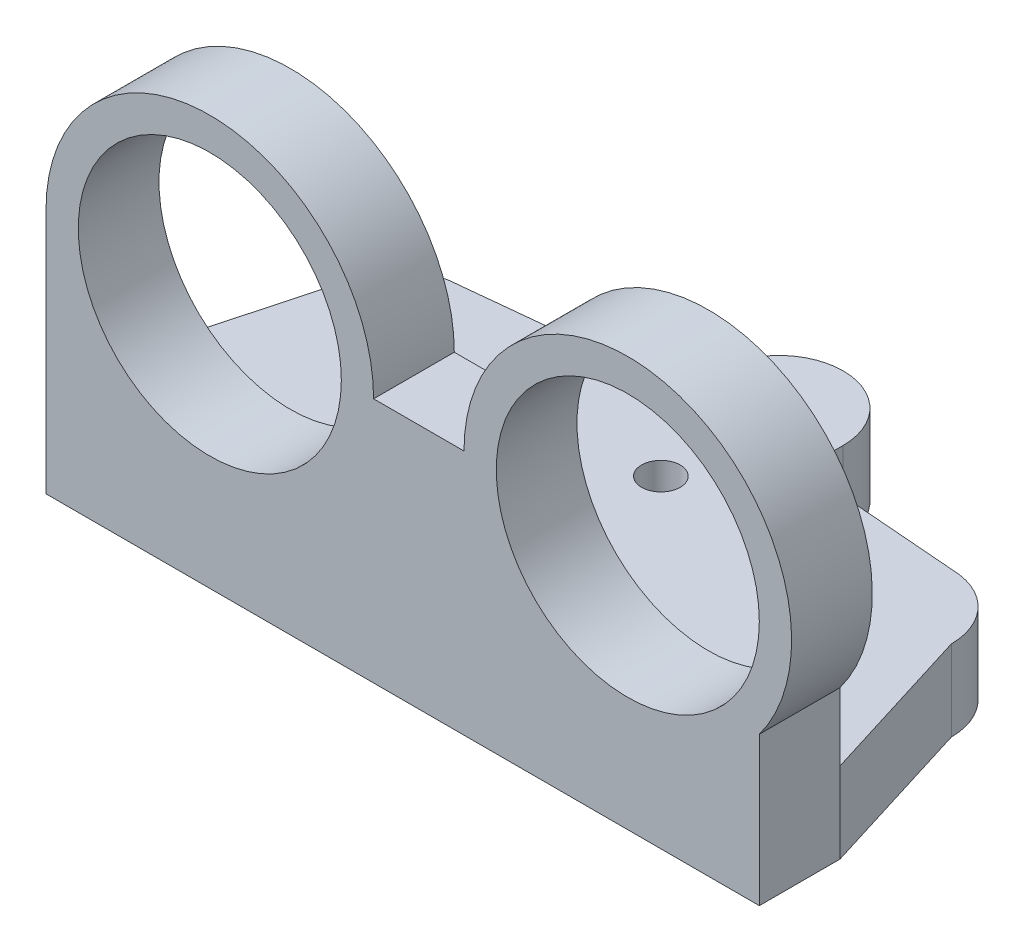
ISO-10303-21;
HEADER;
FILE_DESCRIPTION(('STEP AP214'),'2;1');
FILE_NAME('part.step','',(''),(''),'','','');
FILE_SCHEMA(('AUTOMOTIVE_DESIGN { 1 0 10303 214 1 1 1 1 }'));
ENDSEC;
DATA;
#1=APPLICATION_CONTEXT('core data for automotive mechanical design processes');
#2=APPLICATION_PROTOCOL_DEFINITION('international standard','automotive_design',2000,#1);
#3=PRODUCT_CONTEXT('',#1,'mechanical');
#4=PRODUCT('Part','Part','',(#3));
#5=PRODUCT_RELATED_PRODUCT_CATEGORY('part','',(#4));
#6=PRODUCT_DEFINITION_FORMATION('','',#4);
#7=PRODUCT_DEFINITION_CONTEXT('part definition',#1,'design');
#8=PRODUCT_DEFINITION('design','',#6,#7);
#9=PRODUCT_DEFINITION_SHAPE('','',#8);
#10=(LENGTH_UNIT() NAMED_UNIT(*) SI_UNIT(.MILLI.,.METRE.));
#11=(NAMED_UNIT(*) PLANE_ANGLE_UNIT() SI_UNIT($,.RADIAN.));
#12=(NAMED_UNIT(*) SI_UNIT($,.STERADIAN.) SOLID_ANGLE_UNIT());
#13=UNCERTAINTY_MEASURE_WITH_UNIT(LENGTH_MEASURE(1.E-05),#10,'distance_accuracy_value','');
#14=(GEOMETRIC_REPRESENTATION_CONTEXT(3) GLOBAL_UNCERTAINTY_ASSIGNED_CONTEXT((#13)) GLOBAL_UNIT_ASSIGNED_CONTEXT((#10,
#11,#12)) REPRESENTATION_CONTEXT('',''));
#15=CARTESIAN_POINT('',(0.,0.,0.));
#16=DIRECTION('',(0.,0.,1.));
#17=DIRECTION('',(1.,0.,0.));
#18=AXIS2_PLACEMENT_3D('',#15,#16,#17);
#19=CARTESIAN_POINT('',(-16.4,5.,0.));
#20=DIRECTION('',(0.,1.,0.));
#21=DIRECTION('',(0.,0.,1.));
#22=AXIS2_PLACEMENT_3D('',#19,#20,#21);
#23=PLANE('',#22);
#24=CARTESIAN_POINT('',(0.,5.,0.));
#25=DIRECTION('',(0.,1.,0.));
#26=DIRECTION('',(0.,0.,1.));
#27=AXIS2_PLACEMENT_3D('',#24,#25,#26);
#28=CIRCLE('',#27,1.2);
#29=CARTESIAN_POINT('',(0.,5.,1.2));
#30=VERTEX_POINT('',#29);
#31=EDGE_CURVE('E297',#30,#30,#28,.T.);
#32=ORIENTED_EDGE('',*,*,#31,.F.);
#33=EDGE_LOOP('',(#32));
#34=FACE_BOUND('',#33,.T.);
#35=CARTESIAN_POINT('',(-16.4,5.,0.));
#36=DIRECTION('',(0.,1.,0.));
#37=DIRECTION('',(0.,0.,1.));
#38=AXIS2_PLACEMENT_3D('',#35,#36,#37);
#39=CIRCLE('',#38,4.);
#40=CARTESIAN_POINT('',(-16.5216474494042,5.,-3.998149809356));
#41=VERTEX_POINT('',#40);
#42=CARTESIAN_POINT('',(-20.4,5.,0.));
#43=VERTEX_POINT('',#42);
#44=EDGE_CURVE('E308',#41,#43,#39,.T.);
#45=ORIENTED_EDGE('',*,*,#44,.T.);
#46=DIRECTION('',(-0.260665852290765,0.,0.965429082558387));
#47=VECTOR('',#46,1.);
#48=CARTESIAN_POINT('',(-19.0138875943704,5.,-5.13374965048001));
#49=LINE('',#48,#47);
#50=CARTESIAN_POINT('',(-23.1,5.,10.));
#51=VERTEX_POINT('',#50);
#52=EDGE_CURVE('E472',#43,#51,#49,.T.);
#53=ORIENTED_EDGE('',*,*,#52,.T.);
#54=DIRECTION('',(1.,0.,0.));
#55=VECTOR('',#54,1.);
#56=CARTESIAN_POINT('',(0.,5.,10.));
#57=LINE('',#56,#55);
#58=CARTESIAN_POINT('',(21.1,5.,10.));
#59=VERTEX_POINT('',#58);
#60=EDGE_CURVE('E11',#51,#59,#57,.T.);
#61=ORIENTED_EDGE('',*,*,#60,.T.);
#62=DIRECTION('',(-0.29609877111408,0.,-0.955157326174454));
#63=VECTOR('',#62,1.);
#64=CARTESIAN_POINT('',(16.4218593194052,5.,-5.09077638901559));
#65=LINE('',#64,#63);
#66=CARTESIAN_POINT('',(18.,5.,0.));
#67=VERTEX_POINT('',#66);
#68=EDGE_CURVE('E475',#59,#67,#65,.T.);
#69=ORIENTED_EDGE('',*,*,#68,.T.);
#70=CARTESIAN_POINT('',(14.,5.,0.));
#71=DIRECTION('',(0.,1.,0.));
#72=DIRECTION('',(0.,0.,1.));
#73=AXIS2_PLACEMENT_3D('',#70,#71,#72);
#74=CIRCLE('',#73,4.);
#75=CARTESIAN_POINT('',(14.0925772754253,5.,-3.99892853750537));
#76=VERTEX_POINT('',#75);
#77=EDGE_CURVE('E62',#67,#76,#74,.T.);
#78=ORIENTED_EDGE('',*,*,#77,.T.);
#79=DIRECTION('',(-0.996880972863207,0.,-0.0789197436850038));
#80=VECTOR('',#79,1.);
#81=CARTESIAN_POINT('',(14.0925772754253,5.,-3.99892853750537));
#82=LINE('',#81,#80);
#83=CARTESIAN_POINT('',(4.,5.,-4.79792423847654));
#84=VERTEX_POINT('',#83);
#85=EDGE_CURVE('E311',#76,#84,#82,.T.);
#86=ORIENTED_EDGE('',*,*,#85,.T.);
#87=DIRECTION('',(0.,0.,-1.));
#88=VECTOR('',#87,1.);
#89=CARTESIAN_POINT('',(4.,5.,-4.79792423847654));
#90=LINE('',#89,#88);
#91=CARTESIAN_POINT('',(4.,5.,-7.3));
#92=VERTEX_POINT('',#91);
#93=EDGE_CURVE('E314',#84,#92,#90,.T.);
#94=ORIENTED_EDGE('',*,*,#93,.T.);
#95=CARTESIAN_POINT('',(0.,5.,-7.3));
#96=DIRECTION('',(0.,1.,0.));
#97=DIRECTION('',(0.,0.,1.));
#98=AXIS2_PLACEMENT_3D('',#95,#96,#97);
#99=CIRCLE('',#98,4.);
#100=CARTESIAN_POINT('',(-4.,5.,-7.3));
#101=VERTEX_POINT('',#100);
#102=EDGE_CURVE('E317',#92,#101,#99,.T.);
#103=ORIENTED_EDGE('',*,*,#102,.T.);
#104=DIRECTION('',(0.,0.,1.));
#105=VECTOR('',#104,1.);
#106=CARTESIAN_POINT('',(-4.,5.,-7.3));
#107=LINE('',#106,#105);
#108=CARTESIAN_POINT('',(-4.,5.,-5.30248808533561));
#109=VERTEX_POINT('',#108);
#110=EDGE_CURVE('E300',#101,#109,#107,.T.);
#111=ORIENTED_EDGE('',*,*,#110,.T.);
#112=DIRECTION('',(-0.994618408890778,0.,0.103606084259456));
#113=VECTOR('',#112,1.);
#114=CARTESIAN_POINT('',(-4.,5.,-5.30248808533561));
#115=LINE('',#114,#113);
#116=EDGE_CURVE('E305',#109,#41,#115,.T.);
#117=ORIENTED_EDGE('',*,*,#116,.T.);
#118=EDGE_LOOP('',(#45,#53,#61,#69,#78,#86,#94,#103,#111,#117));
#119=FACE_BOUND('',#118,.T.);
#120=ADVANCED_FACE('F37',(#34,#119),#23,.T.);
#121=CARTESIAN_POINT('',(-16.4,3.,0.));
#122=DIRECTION('',(0.,-1.,0.));
#123=DIRECTION('',(0.,0.,-1.));
#124=AXIS2_PLACEMENT_3D('',#121,#122,#123);
#125=CYLINDRICAL_SURFACE('',#124,2.);
#126=CARTESIAN_POINT('',(-16.4,0.,0.));
#127=DIRECTION('',(0.,1.,0.));
#128=DIRECTION('',(0.,0.,1.));
#129=AXIS2_PLACEMENT_3D('',#126,#127,#128);
#130=CIRCLE('',#129,2.);
#131=CARTESIAN_POINT('',(-16.4,0.,-2.));
#132=VERTEX_POINT('',#131);
#133=CARTESIAN_POINT('',(-16.4,0.,2.));
#134=VERTEX_POINT('',#133);
#135=EDGE_CURVE('E372',#132,#134,#130,.T.);
#136=ORIENTED_EDGE('',*,*,#135,.F.);
#137=DIRECTION('',(0.,-1.,0.));
#138=VECTOR('',#137,1.);
#139=CARTESIAN_POINT('',(-16.4,3.,-2.));
#140=LINE('',#139,#138);
#141=CARTESIAN_POINT('',(-16.4,3.,-2.));
#142=VERTEX_POINT('',#141);
#143=EDGE_CURVE('E46',#142,#132,#140,.T.);
#144=ORIENTED_EDGE('',*,*,#143,.F.);
#145=CARTESIAN_POINT('',(-16.4,3.,0.));
#146=DIRECTION('',(0.,1.,0.));
#147=DIRECTION('',(0.,0.,1.));
#148=AXIS2_PLACEMENT_3D('',#145,#146,#147);
#149=CIRCLE('',#148,2.);
#150=CARTESIAN_POINT('',(-16.4,3.,2.));
#151=VERTEX_POINT('',#150);
#152=EDGE_CURVE('E321',#142,#151,#149,.T.);
#153=ORIENTED_EDGE('',*,*,#152,.T.);
#154=DIRECTION('',(0.,-1.,0.));
#155=VECTOR('',#154,1.);
#156=CARTESIAN_POINT('',(-16.4,3.,2.));
#157=LINE('',#156,#155);
#158=EDGE_CURVE('E407',#151,#134,#157,.T.);
#159=ORIENTED_EDGE('',*,*,#158,.T.);
#160=EDGE_LOOP('',(#136,#144,#153,#159));
#161=FACE_BOUND('',#160,.T.);
#162=ADVANCED_FACE('F496',(#161),#125,.F.);
#163=CARTESIAN_POINT('',(-0.382138256762559,3.,-3.66852726492057));
#164=DIRECTION('',(-0.103606084259456,0.,-0.994618408890778));
#165=DIRECTION('',(-0.994618408890778,0.,0.103606084259456));
#166=AXIS2_PLACEMENT_3D('',#163,#164,#165);
#167=PLANE('',#166);
#168=DIRECTION('',(0.994618408890778,0.,-0.103606084259456));
#169=VECTOR('',#168,1.);
#170=CARTESIAN_POINT('',(-0.382138256762559,0.,-3.66852726492057));
#171=LINE('',#170,#169);
#172=CARTESIAN_POINT('',(-1.99999999999999,0.,-3.5));
#173=VERTEX_POINT('',#172);
#174=EDGE_CURVE('E375',#132,#173,#171,.T.);
#175=ORIENTED_EDGE('',*,*,#174,.T.);
#176=DIRECTION('',(0.,-1.,0.));
#177=VECTOR('',#176,1.);
#178=CARTESIAN_POINT('',(-1.99999999999999,3.,-3.5));
#179=LINE('',#178,#177);
#180=CARTESIAN_POINT('',(-2.,3.,-3.5));
#181=VERTEX_POINT('',#180);
#182=EDGE_CURVE('E428',#181,#173,#179,.T.);
#183=ORIENTED_EDGE('',*,*,#182,.F.);
#184=DIRECTION('',(0.994618408890778,0.,-0.103606084259456));
#185=VECTOR('',#184,1.);
#186=CARTESIAN_POINT('',(-0.382138256762559,3.,-3.66852726492057));
#187=LINE('',#186,#185);
#188=EDGE_CURVE('E324',#142,#181,#187,.T.);
#189=ORIENTED_EDGE('',*,*,#188,.F.);
#190=ORIENTED_EDGE('',*,*,#143,.T.);
#191=EDGE_LOOP('',(#175,#183,#189,#190));
#192=FACE_BOUND('',#191,.T.);
#193=ADVANCED_FACE('F502',(#192),#167,.F.);
#194=CARTESIAN_POINT('',(-2.,3.,0.));
#195=DIRECTION('',(1.,0.,0.));
#196=DIRECTION('',(0.,0.,-1.));
#197=AXIS2_PLACEMENT_3D('',#194,#195,#196);
#198=PLANE('',#197);
#199=DIRECTION('',(0.,0.,1.));
#200=VECTOR('',#199,1.);
#201=CARTESIAN_POINT('',(-2.,0.,0.));
#202=LINE('',#201,#200);
#203=CARTESIAN_POINT('',(-2.,0.,-7.3));
#204=VERTEX_POINT('',#203);
#205=EDGE_CURVE('E378',#204,#173,#202,.T.);
#206=ORIENTED_EDGE('',*,*,#205,.F.);
#207=DIRECTION('',(0.,-1.,0.));
#208=VECTOR('',#207,1.);
#209=CARTESIAN_POINT('',(-2.,3.,-7.3));
#210=LINE('',#209,#208);
#211=CARTESIAN_POINT('',(-2.,3.,-7.3));
#212=VERTEX_POINT('',#211);
#213=EDGE_CURVE('E426',#212,#204,#210,.T.);
#214=ORIENTED_EDGE('',*,*,#213,.F.);
#215=DIRECTION('',(0.,0.,1.));
#216=VECTOR('',#215,1.);
#217=CARTESIAN_POINT('',(-2.,3.,0.));
#218=LINE('',#217,#216);
#219=EDGE_CURVE('E327',#212,#181,#218,.T.);
#220=ORIENTED_EDGE('',*,*,#219,.T.);
#221=ORIENTED_EDGE('',*,*,#182,.T.);
#222=EDGE_LOOP('',(#206,#214,#220,#221));
#223=FACE_BOUND('',#222,.T.);
#224=ADVANCED_FACE('F550',(#223),#198,.T.);
#225=CARTESIAN_POINT('',(0.,3.,-7.3));
#226=DIRECTION('',(0.,-1.,0.));
#227=DIRECTION('',(0.,0.,-1.));
#228=AXIS2_PLACEMENT_3D('',#225,#226,#227);
#229=CYLINDRICAL_SURFACE('',#228,2.);
#230=CARTESIAN_POINT('',(0.,0.,-7.3));
#231=DIRECTION('',(0.,1.,0.));
#232=DIRECTION('',(0.,0.,1.));
#233=AXIS2_PLACEMENT_3D('',#230,#231,#232);
#234=CIRCLE('',#233,2.);
#235=CARTESIAN_POINT('',(2.,0.,-7.3));
#236=VERTEX_POINT('',#235);
#237=EDGE_CURVE('E381',#236,#204,#234,.T.);
#238=ORIENTED_EDGE('',*,*,#237,.F.);
#239=DIRECTION('',(0.,-1.,0.));
#240=VECTOR('',#239,1.);
#241=CARTESIAN_POINT('',(2.,3.,-7.3));
#242=LINE('',#241,#240);
#243=CARTESIAN_POINT('',(2.,3.,-7.3));
#244=VERTEX_POINT('',#243);
#245=EDGE_CURVE('E424',#244,#236,#242,.T.);
#246=ORIENTED_EDGE('',*,*,#245,.F.);
#247=CARTESIAN_POINT('',(0.,3.,-7.3));
#248=DIRECTION('',(0.,1.,0.));
#249=DIRECTION('',(0.,0.,1.));
#250=AXIS2_PLACEMENT_3D('',#247,#248,#249);
#251=CIRCLE('',#250,2.);
#252=EDGE_CURVE('E330',#244,#212,#251,.T.);
#253=ORIENTED_EDGE('',*,*,#252,.T.);
#254=ORIENTED_EDGE('',*,*,#213,.T.);
#255=EDGE_LOOP('',(#238,#246,#253,#254));
#256=FACE_BOUND('',#255,.T.);
#257=ADVANCED_FACE('F546',(#256),#229,.F.);
#258=CARTESIAN_POINT('',(2.,3.,0.));
#259=DIRECTION('',(1.,0.,0.));
#260=DIRECTION('',(0.,0.,-1.));
#261=AXIS2_PLACEMENT_3D('',#258,#259,#260);
#262=PLANE('',#261);
#263=DIRECTION('',(0.,0.,1.));
#264=VECTOR('',#263,1.);
#265=CARTESIAN_POINT('',(2.,0.,0.));
#266=LINE('',#265,#264);
#267=CARTESIAN_POINT('',(2.,0.,-2.95));
#268=VERTEX_POINT('',#267);
#269=EDGE_CURVE('E384',#236,#268,#266,.T.);
#270=ORIENTED_EDGE('',*,*,#269,.T.);
#271=DIRECTION('',(0.,-1.,0.));
#272=VECTOR('',#271,1.);
#273=CARTESIAN_POINT('',(2.,3.,-2.95));
#274=LINE('',#273,#272);
#275=CARTESIAN_POINT('',(2.,3.,-2.95));
#276=VERTEX_POINT('',#275);
#277=EDGE_CURVE('E422',#276,#268,#274,.T.);
#278=ORIENTED_EDGE('',*,*,#277,.F.);
#279=DIRECTION('',(0.,0.,1.));
#280=VECTOR('',#279,1.);
#281=CARTESIAN_POINT('',(2.,3.,0.));
#282=LINE('',#281,#280);
#283=EDGE_CURVE('E333',#244,#276,#282,.T.);
#284=ORIENTED_EDGE('',*,*,#283,.F.);
#285=ORIENTED_EDGE('',*,*,#245,.T.);
#286=EDGE_LOOP('',(#270,#278,#284,#285));
#287=FACE_BOUND('',#286,.T.);
#288=ADVANCED_FACE('F542',(#287),#262,.F.);
#289=CARTESIAN_POINT('',(0.244543744931938,3.,-3.08897362019289));
#290=DIRECTION('',(-0.0789197436850041,0.,0.996880972863207));
#291=DIRECTION('',(0.996880972863207,0.,0.0789197436850041));
#292=AXIS2_PLACEMENT_3D('',#289,#290,#291);
#293=PLANE('',#292);
#294=DIRECTION('',(-0.996880972863207,0.,-0.0789197436850041));
#295=VECTOR('',#294,1.);
#296=CARTESIAN_POINT('',(0.244543744931938,0.,-3.08897362019289));
#297=LINE('',#296,#295);
#298=CARTESIAN_POINT('',(14.,0.,-2.));
#299=VERTEX_POINT('',#298);
#300=EDGE_CURVE('E387',#299,#268,#297,.T.);
#301=ORIENTED_EDGE('',*,*,#300,.F.);
#302=DIRECTION('',(0.,-1.,0.));
#303=VECTOR('',#302,1.);
#304=CARTESIAN_POINT('',(14.,3.,-2.));
#305=LINE('',#304,#303);
#306=CARTESIAN_POINT('',(14.,3.,-2.));
#307=VERTEX_POINT('',#306);
#308=EDGE_CURVE('E420',#307,#299,#305,.T.);
#309=ORIENTED_EDGE('',*,*,#308,.F.);
#310=DIRECTION('',(-0.996880972863207,0.,-0.0789197436850041));
#311=VECTOR('',#310,1.);
#312=CARTESIAN_POINT('',(0.244543744931938,3.,-3.08897362019289));
#313=LINE('',#312,#311);
#314=EDGE_CURVE('E335',#307,#276,#313,.T.);
#315=ORIENTED_EDGE('',*,*,#314,.T.);
#316=ORIENTED_EDGE('',*,*,#277,.T.);
#317=EDGE_LOOP('',(#301,#309,#315,#316));
#318=FACE_BOUND('',#317,.T.);
#319=ADVANCED_FACE('F538',(#318),#293,.T.);
#320=CARTESIAN_POINT('',(14.,3.,0.));
#321=DIRECTION('',(0.,-1.,0.));
#322=DIRECTION('',(0.,0.,-1.));
#323=AXIS2_PLACEMENT_3D('',#320,#321,#322);
#324=CYLINDRICAL_SURFACE('',#323,2.);
#325=CARTESIAN_POINT('',(14.,0.,0.));
#326=DIRECTION('',(0.,1.,0.));
#327=DIRECTION('',(0.,0.,1.));
#328=AXIS2_PLACEMENT_3D('',#325,#326,#327);
#329=CIRCLE('',#328,2.);
#330=CARTESIAN_POINT('',(14.,0.,2.));
#331=VERTEX_POINT('',#330);
#332=EDGE_CURVE('E390',#331,#299,#329,.T.);
#333=ORIENTED_EDGE('',*,*,#332,.F.);
#334=DIRECTION('',(0.,-1.,0.));
#335=VECTOR('',#334,1.);
#336=CARTESIAN_POINT('',(14.,3.,2.));
#337=LINE('',#336,#335);
#338=CARTESIAN_POINT('',(14.,3.,2.));
#339=VERTEX_POINT('',#338);
#340=EDGE_CURVE('E418',#339,#331,#337,.T.);
#341=ORIENTED_EDGE('',*,*,#340,.F.);
#342=CARTESIAN_POINT('',(14.,3.,0.));
#343=DIRECTION('',(0.,1.,0.));
#344=DIRECTION('',(0.,0.,1.));
#345=AXIS2_PLACEMENT_3D('',#342,#343,#344);
#346=CIRCLE('',#345,2.);
#347=EDGE_CURVE('E338',#339,#307,#346,.T.);
#348=ORIENTED_EDGE('',*,*,#347,.T.);
#349=ORIENTED_EDGE('',*,*,#308,.T.);
#350=EDGE_LOOP('',(#333,#341,#348,#349));
#351=FACE_BOUND('',#350,.T.);
#352=ADVANCED_FACE('F534',(#351),#324,.F.);
#353=CARTESIAN_POINT('',(0.244543744931938,3.,3.08897362019289));
#354=DIRECTION('',(0.0789197436850041,0.,0.996880972863207));
#355=DIRECTION('',(0.996880972863207,0.,-0.0789197436850041));
#356=AXIS2_PLACEMENT_3D('',#353,#354,#355);
#357=PLANE('',#356);
#358=DIRECTION('',(-0.996880972863207,0.,0.0789197436850041));
#359=VECTOR('',#358,1.);
#360=CARTESIAN_POINT('',(0.244543744931938,0.,3.08897362019289));
#361=LINE('',#360,#359);
#362=CARTESIAN_POINT('',(2.,0.,2.95));
#363=VERTEX_POINT('',#362);
#364=EDGE_CURVE('E393',#331,#363,#361,.T.);
#365=ORIENTED_EDGE('',*,*,#364,.T.);
#366=DIRECTION('',(0.,-1.,0.));
#367=VECTOR('',#366,1.);
#368=CARTESIAN_POINT('',(2.,3.,2.95));
#369=LINE('',#368,#367);
#370=CARTESIAN_POINT('',(2.,3.,2.95));
#371=VERTEX_POINT('',#370);
#372=EDGE_CURVE('E415',#371,#363,#369,.T.);
#373=ORIENTED_EDGE('',*,*,#372,.F.);
#374=DIRECTION('',(-0.996880972863207,0.,0.0789197436850041));
#375=VECTOR('',#374,1.);
#376=CARTESIAN_POINT('',(0.244543744931938,3.,3.08897362019289));
#377=LINE('',#376,#375);
#378=EDGE_CURVE('E341',#339,#371,#377,.T.);
#379=ORIENTED_EDGE('',*,*,#378,.F.);
#380=ORIENTED_EDGE('',*,*,#340,.T.);
#381=EDGE_LOOP('',(#365,#373,#379,#380));
#382=FACE_BOUND('',#381,.T.);
#383=ADVANCED_FACE('F530',(#382),#357,.F.);
#384=CARTESIAN_POINT('',(2.,3.,0.));
#385=DIRECTION('',(1.,0.,0.));
#386=DIRECTION('',(0.,0.,-1.));
#387=AXIS2_PLACEMENT_3D('',#384,#385,#386);
#388=PLANE('',#387);
#389=DIRECTION('',(0.,0.,1.));
#390=VECTOR('',#389,1.);
#391=CARTESIAN_POINT('',(2.,0.,0.));
#392=LINE('',#391,#390);
#393=CARTESIAN_POINT('',(2.,0.,7.3));
#394=VERTEX_POINT('',#393);
#395=EDGE_CURVE('E396',#363,#394,#392,.T.);
#396=ORIENTED_EDGE('',*,*,#395,.T.);
#397=DIRECTION('',(0.,-1.,0.));
#398=VECTOR('',#397,1.);
#399=CARTESIAN_POINT('',(2.,3.,7.3));
#400=LINE('',#399,#398);
#401=CARTESIAN_POINT('',(2.,3.,7.3));
#402=VERTEX_POINT('',#401);
#403=EDGE_CURVE('E413',#402,#394,#400,.T.);
#404=ORIENTED_EDGE('',*,*,#403,.F.);
#405=DIRECTION('',(0.,0.,1.));
#406=VECTOR('',#405,1.);
#407=CARTESIAN_POINT('',(2.,3.,0.));
#408=LINE('',#407,#406);
#409=EDGE_CURVE('E343',#371,#402,#408,.T.);
#410=ORIENTED_EDGE('',*,*,#409,.F.);
#411=ORIENTED_EDGE('',*,*,#372,.T.);
#412=EDGE_LOOP('',(#396,#404,#410,#411));
#413=FACE_BOUND('',#412,.T.);
#414=ADVANCED_FACE('F526',(#413),#388,.F.);
#415=CARTESIAN_POINT('',(0.,3.,7.3));
#416=DIRECTION('',(0.,-1.,0.));
#417=DIRECTION('',(0.,0.,-1.));
#418=AXIS2_PLACEMENT_3D('',#415,#416,#417);
#419=CYLINDRICAL_SURFACE('',#418,2.);
#420=CARTESIAN_POINT('',(0.,0.,7.3));
#421=DIRECTION('',(0.,1.,0.));
#422=DIRECTION('',(0.,0.,1.));
#423=AXIS2_PLACEMENT_3D('',#420,#421,#422);
#424=CIRCLE('',#423,2.);
#425=CARTESIAN_POINT('',(-2.,0.,7.3));
#426=VERTEX_POINT('',#425);
#427=EDGE_CURVE('E399',#426,#394,#424,.T.);
#428=ORIENTED_EDGE('',*,*,#427,.F.);
#429=DIRECTION('',(0.,-1.,0.));
#430=VECTOR('',#429,1.);
#431=CARTESIAN_POINT('',(-2.,3.,7.3));
#432=LINE('',#431,#430);
#433=CARTESIAN_POINT('',(-2.,3.,7.3));
#434=VERTEX_POINT('',#433);
#435=EDGE_CURVE('E411',#434,#426,#432,.T.);
#436=ORIENTED_EDGE('',*,*,#435,.F.);
#437=CARTESIAN_POINT('',(0.,3.,7.3));
#438=DIRECTION('',(0.,1.,0.));
#439=DIRECTION('',(0.,0.,1.));
#440=AXIS2_PLACEMENT_3D('',#437,#438,#439);
#441=CIRCLE('',#440,2.);
#442=EDGE_CURVE('E345',#434,#402,#441,.T.);
#443=ORIENTED_EDGE('',*,*,#442,.T.);
#444=ORIENTED_EDGE('',*,*,#403,.T.);
#445=EDGE_LOOP('',(#428,#436,#443,#444));
#446=FACE_BOUND('',#445,.T.);
#447=ADVANCED_FACE('F522',(#446),#419,.F.);
#448=CARTESIAN_POINT('',(-2.,3.,0.));
#449=DIRECTION('',(1.,0.,0.));
#450=DIRECTION('',(0.,0.,-1.));
#451=AXIS2_PLACEMENT_3D('',#448,#449,#450);
#452=PLANE('',#451);
#453=DIRECTION('',(0.,0.,1.));
#454=VECTOR('',#453,1.);
#455=CARTESIAN_POINT('',(-2.,0.,0.));
#456=LINE('',#455,#454);
#457=CARTESIAN_POINT('',(-1.99999999999999,0.,3.5));
#458=VERTEX_POINT('',#457);
#459=EDGE_CURVE('E402',#458,#426,#456,.T.);
#460=ORIENTED_EDGE('',*,*,#459,.F.);
#461=DIRECTION('',(0.,-1.,0.));
#462=VECTOR('',#461,1.);
#463=CARTESIAN_POINT('',(-1.99999999999999,3.,3.5));
#464=LINE('',#463,#462);
#465=CARTESIAN_POINT('',(-1.99999999999999,3.,3.5));
#466=VERTEX_POINT('',#465);
#467=EDGE_CURVE('E409',#466,#458,#464,.T.);
#468=ORIENTED_EDGE('',*,*,#467,.F.);
#469=DIRECTION('',(0.,0.,1.));
#470=VECTOR('',#469,1.);
#471=CARTESIAN_POINT('',(-2.,3.,0.));
#472=LINE('',#471,#470);
#473=EDGE_CURVE('E348',#466,#434,#472,.T.);
#474=ORIENTED_EDGE('',*,*,#473,.T.);
#475=ORIENTED_EDGE('',*,*,#435,.T.);
#476=EDGE_LOOP('',(#460,#468,#474,#475));
#477=FACE_BOUND('',#476,.T.);
#478=ADVANCED_FACE('F519',(#477),#452,.T.);
#479=CARTESIAN_POINT('',(-0.589350425281471,3.,-5.65776408270212));
#480=DIRECTION('',(-0.103606084259456,0.,-0.994618408890778));
#481=DIRECTION('',(-0.994618408890778,0.,0.103606084259456));
#482=AXIS2_PLACEMENT_3D('',#479,#480,#481);
#483=PLANE('',#482);
#484=DIRECTION('',(0.994618408890778,0.,-0.103606084259456));
#485=VECTOR('',#484,1.);
#486=CARTESIAN_POINT('',(-0.589350425281471,0.,-5.65776408270212));
#487=LINE('',#486,#485);
#488=CARTESIAN_POINT('',(-16.5216474494042,0.,-3.998149809356));
#489=VERTEX_POINT('',#488);
#490=CARTESIAN_POINT('',(-4.,0.,-5.30248808533561));
#491=VERTEX_POINT('',#490);
#492=EDGE_CURVE('E320',#489,#491,#487,.T.);
#493=ORIENTED_EDGE('',*,*,#492,.F.);
#494=DIRECTION('',(0.,-1.,0.));
#495=VECTOR('',#494,1.);
#496=CARTESIAN_POINT('',(-16.5216474494042,3.,-3.998149809356));
#497=LINE('',#496,#495);
#498=EDGE_CURVE('E41',#41,#489,#497,.T.);
#499=ORIENTED_EDGE('',*,*,#498,.F.);
#500=ORIENTED_EDGE('',*,*,#116,.F.);
#501=DIRECTION('',(0.,-1.,0.));
#502=VECTOR('',#501,1.);
#503=CARTESIAN_POINT('',(-4.,3.,-5.30248808533561));
#504=LINE('',#503,#502);
#505=EDGE_CURVE('E354',#109,#491,#504,.T.);
#506=ORIENTED_EDGE('',*,*,#505,.T.);
#507=EDGE_LOOP('',(#493,#499,#500,#506));
#508=FACE_BOUND('',#507,.T.);
#509=ADVANCED_FACE('F39',(#508),#483,.T.);
#510=CARTESIAN_POINT('',(-16.4,3.,0.));
#511=DIRECTION('',(0.,-1.,0.));
#512=DIRECTION('',(0.,0.,-1.));
#513=AXIS2_PLACEMENT_3D('',#510,#511,#512);
#514=CYLINDRICAL_SURFACE('',#513,4.);
#515=CARTESIAN_POINT('',(-16.4,0.,0.));
#516=DIRECTION('',(0.,1.,0.));
#517=DIRECTION('',(0.,0.,1.));
#518=AXIS2_PLACEMENT_3D('',#515,#516,#517);
#519=CIRCLE('',#518,4.);
#520=CARTESIAN_POINT('',(-20.4,0.,0.));
#521=VERTEX_POINT('',#520);
#522=EDGE_CURVE('E357',#489,#521,#519,.T.);
#523=ORIENTED_EDGE('',*,*,#522,.T.);
#524=DIRECTION('',(0.,1.,0.));
#525=VECTOR('',#524,1.);
#526=CARTESIAN_POINT('',(-20.4,-46.6759038477028,0.));
#527=LINE('',#526,#525);
#528=EDGE_CURVE('E54',#521,#43,#527,.T.);
#529=ORIENTED_EDGE('',*,*,#528,.T.);
#530=ORIENTED_EDGE('',*,*,#44,.F.);
#531=ORIENTED_EDGE('',*,*,#498,.T.);
#532=EDGE_LOOP('',(#523,#529,#530,#531));
#533=FACE_BOUND('',#532,.T.);
#534=ADVANCED_FACE('F444',(#533),#514,.T.);
#535=CARTESIAN_POINT('',(14.,3.,0.));
#536=DIRECTION('',(0.,-1.,0.));
#537=DIRECTION('',(0.,0.,-1.));
#538=AXIS2_PLACEMENT_3D('',#535,#536,#537);
#539=CYLINDRICAL_SURFACE('',#538,4.);
#540=ORIENTED_EDGE('',*,*,#77,.F.);
#541=DIRECTION('',(0.,1.,0.));
#542=VECTOR('',#541,1.);
#543=CARTESIAN_POINT('',(18.,-46.6759038477028,0.));
#544=LINE('',#543,#542);
#545=CARTESIAN_POINT('',(18.,0.,0.));
#546=VERTEX_POINT('',#545);
#547=EDGE_CURVE('E465',#546,#67,#544,.T.);
#548=ORIENTED_EDGE('',*,*,#547,.F.);
#549=CARTESIAN_POINT('',(14.,0.,0.));
#550=DIRECTION('',(0.,1.,0.));
#551=DIRECTION('',(0.,0.,1.));
#552=AXIS2_PLACEMENT_3D('',#549,#550,#551);
#553=CIRCLE('',#552,4.);
#554=CARTESIAN_POINT('',(14.0925772754253,0.,-3.99892853750537));
#555=VERTEX_POINT('',#554);
#556=EDGE_CURVE('E359',#546,#555,#553,.T.);
#557=ORIENTED_EDGE('',*,*,#556,.T.);
#558=DIRECTION('',(0.,-1.,0.));
#559=VECTOR('',#558,1.);
#560=CARTESIAN_POINT('',(14.0925772754253,3.,-3.99892853750537));
#561=LINE('',#560,#559);
#562=EDGE_CURVE('E438',#76,#555,#561,.T.);
#563=ORIENTED_EDGE('',*,*,#562,.F.);
#564=EDGE_LOOP('',(#540,#548,#557,#563));
#565=FACE_BOUND('',#564,.T.);
#566=ADVANCED_FACE('F714',(#565),#539,.T.);
#567=CARTESIAN_POINT('',(0.402383232301946,3.,-5.0827355659193));
#568=DIRECTION('',(-0.0789197436850041,0.,0.996880972863207));
#569=DIRECTION('',(0.996880972863207,0.,0.0789197436850041));
#570=AXIS2_PLACEMENT_3D('',#567,#568,#569);
#571=PLANE('',#570);
#572=DIRECTION('',(-0.996880972863207,0.,-0.0789197436850041));
#573=VECTOR('',#572,1.);
#574=CARTESIAN_POINT('',(0.402383232301946,0.,-5.0827355659193));
#575=LINE('',#574,#573);
#576=CARTESIAN_POINT('',(4.,0.,-4.79792423847654));
#577=VERTEX_POINT('',#576);
#578=EDGE_CURVE('E361',#555,#577,#575,.T.);
#579=ORIENTED_EDGE('',*,*,#578,.T.);
#580=DIRECTION('',(0.,-1.,0.));
#581=VECTOR('',#580,1.);
#582=CARTESIAN_POINT('',(4.,3.,-4.79792423847654));
#583=LINE('',#582,#581);
#584=EDGE_CURVE('E437',#84,#577,#583,.T.);
#585=ORIENTED_EDGE('',*,*,#584,.F.);
#586=ORIENTED_EDGE('',*,*,#85,.F.);
#587=ORIENTED_EDGE('',*,*,#562,.T.);
#588=EDGE_LOOP('',(#579,#585,#586,#587));
#589=FACE_BOUND('',#588,.T.);
#590=ADVANCED_FACE('F458',(#589),#571,.F.);
#591=CARTESIAN_POINT('',(4.,3.,0.));
#592=DIRECTION('',(1.,0.,0.));
#593=DIRECTION('',(0.,0.,-1.));
#594=AXIS2_PLACEMENT_3D('',#591,#592,#593);
#595=PLANE('',#594);
#596=DIRECTION('',(0.,0.,1.));
#597=VECTOR('',#596,1.);
#598=CARTESIAN_POINT('',(4.,0.,0.));
#599=LINE('',#598,#597);
#600=CARTESIAN_POINT('',(4.,0.,-7.3));
#601=VERTEX_POINT('',#600);
#602=EDGE_CURVE('E364',#601,#577,#599,.T.);
#603=ORIENTED_EDGE('',*,*,#602,.F.);
#604=DIRECTION('',(0.,-1.,0.));
#605=VECTOR('',#604,1.);
#606=CARTESIAN_POINT('',(4.,3.,-7.3));
#607=LINE('',#606,#605);
#608=EDGE_CURVE('E435',#92,#601,#607,.T.);
#609=ORIENTED_EDGE('',*,*,#608,.F.);
#610=ORIENTED_EDGE('',*,*,#93,.F.);
#611=ORIENTED_EDGE('',*,*,#584,.T.);
#612=EDGE_LOOP('',(#603,#609,#610,#611));
#613=FACE_BOUND('',#612,.T.);
#614=ADVANCED_FACE('F456',(#613),#595,.T.);
#615=CARTESIAN_POINT('',(0.,3.,-7.3));
#616=DIRECTION('',(0.,-1.,0.));
#617=DIRECTION('',(0.,0.,-1.));
#618=AXIS2_PLACEMENT_3D('',#615,#616,#617);
#619=CYLINDRICAL_SURFACE('',#618,4.);
#620=CARTESIAN_POINT('',(0.,0.,-7.3));
#621=DIRECTION('',(0.,1.,0.));
#622=DIRECTION('',(0.,0.,1.));
#623=AXIS2_PLACEMENT_3D('',#620,#621,#622);
#624=CIRCLE('',#623,4.);
#625=CARTESIAN_POINT('',(-4.,0.,-7.3));
#626=VERTEX_POINT('',#625);
#627=EDGE_CURVE('E367',#601,#626,#624,.T.);
#628=ORIENTED_EDGE('',*,*,#627,.T.);
#629=DIRECTION('',(0.,-1.,0.));
#630=VECTOR('',#629,1.);
#631=CARTESIAN_POINT('',(-4.,3.,-7.3));
#632=LINE('',#631,#630);
#633=EDGE_CURVE('E432',#101,#626,#632,.T.);
#634=ORIENTED_EDGE('',*,*,#633,.F.);
#635=ORIENTED_EDGE('',*,*,#102,.F.);
#636=ORIENTED_EDGE('',*,*,#608,.T.);
#637=EDGE_LOOP('',(#628,#634,#635,#636));
#638=FACE_BOUND('',#637,.T.);
#639=ADVANCED_FACE('F485',(#638),#619,.T.);
#640=CARTESIAN_POINT('',(-4.,3.,0.));
#641=DIRECTION('',(1.,0.,0.));
#642=DIRECTION('',(0.,0.,-1.));
#643=AXIS2_PLACEMENT_3D('',#640,#641,#642);
#644=PLANE('',#643);
#645=DIRECTION('',(0.,0.,1.));
#646=VECTOR('',#645,1.);
#647=CARTESIAN_POINT('',(-4.,0.,0.));
#648=LINE('',#647,#646);
#649=EDGE_CURVE('E369',#626,#491,#648,.T.);
#650=ORIENTED_EDGE('',*,*,#649,.T.);
#651=ORIENTED_EDGE('',*,*,#505,.F.);
#652=ORIENTED_EDGE('',*,*,#110,.F.);
#653=ORIENTED_EDGE('',*,*,#633,.T.);
#654=EDGE_LOOP('',(#650,#651,#652,#653));
#655=FACE_BOUND('',#654,.T.);
#656=ADVANCED_FACE('F451',(#655),#644,.F.);
#657=CARTESIAN_POINT('',(-0.382138256762559,3.,3.66852726492057));
#658=DIRECTION('',(0.103606084259456,0.,-0.994618408890778));
#659=DIRECTION('',(-0.994618408890778,0.,-0.103606084259456));
#660=AXIS2_PLACEMENT_3D('',#657,#658,#659);
#661=PLANE('',#660);
#662=DIRECTION('',(0.994618408890778,0.,0.103606084259456));
#663=VECTOR('',#662,1.);
#664=CARTESIAN_POINT('',(-0.382138256762559,0.,3.66852726492057));
#665=LINE('',#664,#663);
#666=EDGE_CURVE('E325',#134,#458,#665,.T.);
#667=ORIENTED_EDGE('',*,*,#666,.F.);
#668=ORIENTED_EDGE('',*,*,#158,.F.);
#669=DIRECTION('',(0.994618408890778,0.,0.103606084259456));
#670=VECTOR('',#669,1.);
#671=CARTESIAN_POINT('',(-0.382138256762559,3.,3.66852726492057));
#672=LINE('',#671,#670);
#673=EDGE_CURVE('E351',#151,#466,#672,.T.);
#674=ORIENTED_EDGE('',*,*,#673,.T.);
#675=ORIENTED_EDGE('',*,*,#467,.T.);
#676=EDGE_LOOP('',(#667,#668,#674,#675));
#677=FACE_BOUND('',#676,.T.);
#678=ADVANCED_FACE('F492',(#677),#661,.T.);
#679=CARTESIAN_POINT('',(0.,0.,0.));
#680=DIRECTION('',(0.,1.,0.));
#681=DIRECTION('',(0.,0.,1.));
#682=AXIS2_PLACEMENT_3D('',#679,#680,#681);
#683=PLANE('',#682);
#684=DIRECTION('',(0.260665852290765,0.,-0.965429082558387));
#685=VECTOR('',#684,1.);
#686=CARTESIAN_POINT('',(-19.0138875943704,0.,-5.13374965048001));
#687=LINE('',#686,#685);
#688=CARTESIAN_POINT('',(-23.1,0.,9.99999999999999));
#689=VERTEX_POINT('',#688);
#690=EDGE_CURVE('E249',#689,#521,#687,.T.);
#691=ORIENTED_EDGE('',*,*,#690,.T.);
#692=ORIENTED_EDGE('',*,*,#522,.F.);
#693=ORIENTED_EDGE('',*,*,#492,.T.);
#694=ORIENTED_EDGE('',*,*,#649,.F.);
#695=ORIENTED_EDGE('',*,*,#627,.F.);
#696=ORIENTED_EDGE('',*,*,#602,.T.);
#697=ORIENTED_EDGE('',*,*,#578,.F.);
#698=ORIENTED_EDGE('',*,*,#556,.F.);
#699=DIRECTION('',(0.29609877111408,0.,0.955157326174454));
#700=VECTOR('',#699,1.);
#701=CARTESIAN_POINT('',(16.4218593194052,0.,-5.09077638901559));
#702=LINE('',#701,#700);
#703=CARTESIAN_POINT('',(21.1,0.,10.));
#704=VERTEX_POINT('',#703);
#705=EDGE_CURVE('E254',#546,#704,#702,.T.);
#706=ORIENTED_EDGE('',*,*,#705,.T.);
#707=DIRECTION('',(0.,0.,1.));
#708=VECTOR('',#707,1.);
#709=CARTESIAN_POINT('',(21.1,0.,0.));
#710=LINE('',#709,#708);
#711=CARTESIAN_POINT('',(21.1,0.,15.));
#712=VERTEX_POINT('',#711);
#713=EDGE_CURVE('E241',#704,#712,#710,.T.);
#714=ORIENTED_EDGE('',*,*,#713,.T.);
#715=DIRECTION('',(-1.,0.,0.));
#716=VECTOR('',#715,1.);
#717=CARTESIAN_POINT('',(0.,0.,15.));
#718=LINE('',#717,#716);
#719=CARTESIAN_POINT('',(-23.1,0.,15.));
#720=VERTEX_POINT('',#719);
#721=EDGE_CURVE('E223',#712,#720,#718,.T.);
#722=ORIENTED_EDGE('',*,*,#721,.T.);
#723=DIRECTION('',(0.,0.,-1.));
#724=VECTOR('',#723,1.);
#725=CARTESIAN_POINT('',(-23.1,0.,0.));
#726=LINE('',#725,#724);
#727=EDGE_CURVE('E238',#720,#689,#726,.T.);
#728=ORIENTED_EDGE('',*,*,#727,.T.);
#729=EDGE_LOOP('',(#691,#692,#693,#694,#695,#696,#697,#698,#706,#714,#722,#728));
#730=FACE_BOUND('',#729,.T.);
#731=ORIENTED_EDGE('',*,*,#135,.T.);
#732=ORIENTED_EDGE('',*,*,#666,.T.);
#733=ORIENTED_EDGE('',*,*,#459,.T.);
#734=ORIENTED_EDGE('',*,*,#427,.T.);
#735=ORIENTED_EDGE('',*,*,#395,.F.);
#736=ORIENTED_EDGE('',*,*,#364,.F.);
#737=ORIENTED_EDGE('',*,*,#332,.T.);
#738=ORIENTED_EDGE('',*,*,#300,.T.);
#739=ORIENTED_EDGE('',*,*,#269,.F.);
#740=ORIENTED_EDGE('',*,*,#237,.T.);
#741=ORIENTED_EDGE('',*,*,#205,.T.);
#742=ORIENTED_EDGE('',*,*,#174,.F.);
#743=EDGE_LOOP('',(#731,#732,#733,#734,#735,#736,#737,#738,#739,#740,#741,#742));
#744=FACE_BOUND('',#743,.T.);
#745=ADVANCED_FACE('F236',(#730,#744),#683,.F.);
#746=CARTESIAN_POINT('',(-16.4,3.,0.));
#747=DIRECTION('',(0.,1.,0.));
#748=DIRECTION('',(0.,0.,1.));
#749=AXIS2_PLACEMENT_3D('',#746,#747,#748);
#750=PLANE('',#749);
#751=ORIENTED_EDGE('',*,*,#152,.F.);
#752=ORIENTED_EDGE('',*,*,#188,.T.);
#753=ORIENTED_EDGE('',*,*,#219,.F.);
#754=ORIENTED_EDGE('',*,*,#252,.F.);
#755=ORIENTED_EDGE('',*,*,#283,.T.);
#756=ORIENTED_EDGE('',*,*,#314,.F.);
#757=ORIENTED_EDGE('',*,*,#347,.F.);
#758=ORIENTED_EDGE('',*,*,#378,.T.);
#759=ORIENTED_EDGE('',*,*,#409,.T.);
#760=ORIENTED_EDGE('',*,*,#442,.F.);
#761=ORIENTED_EDGE('',*,*,#473,.F.);
#762=ORIENTED_EDGE('',*,*,#673,.F.);
#763=EDGE_LOOP('',(#751,#752,#753,#754,#755,#756,#757,#758,#759,#760,#761,#762));
#764=FACE_BOUND('',#763,.T.);
#765=CARTESIAN_POINT('',(0.,3.,0.));
#766=DIRECTION('',(0.,1.,0.));
#767=DIRECTION('',(0.,0.,1.));
#768=AXIS2_PLACEMENT_3D('',#765,#766,#767);
#769=CIRCLE('',#768,1.2);
#770=CARTESIAN_POINT('',(0.,3.,1.2));
#771=VERTEX_POINT('',#770);
#772=EDGE_CURVE('E296',#771,#771,#769,.T.);
#773=ORIENTED_EDGE('',*,*,#772,.T.);
#774=EDGE_LOOP('',(#773));
#775=FACE_BOUND('',#774,.T.);
#776=ADVANCED_FACE('F510',(#764,#775),#750,.F.);
#777=CARTESIAN_POINT('',(0.,5.,0.));
#778=DIRECTION('',(0.,-1.,0.));
#779=DIRECTION('',(0.,0.,-1.));
#780=AXIS2_PLACEMENT_3D('',#777,#778,#779);
#781=CYLINDRICAL_SURFACE('',#780,1.2);
#782=ORIENTED_EDGE('',*,*,#31,.T.);
#783=EDGE_LOOP('',(#782));
#784=FACE_BOUND('',#783,.T.);
#785=ORIENTED_EDGE('',*,*,#772,.F.);
#786=EDGE_LOOP('',(#785));
#787=FACE_BOUND('',#786,.T.);
#788=ADVANCED_FACE('F508',(#784,#787),#781,.F.);
#789=CARTESIAN_POINT('',(21.1,0.,15.));
#790=DIRECTION('',(1.,0.,0.));
#791=DIRECTION('',(0.,0.,-1.));
#792=AXIS2_PLACEMENT_3D('',#789,#790,#791);
#793=PLANE('',#792);
#794=DIRECTION('',(0.,-1.,0.));
#795=VECTOR('',#794,1.);
#796=CARTESIAN_POINT('',(21.1,0.,10.));
#797=LINE('',#796,#795);
#798=CARTESIAN_POINT('',(21.1,9.20020661509832,10.));
#799=VERTEX_POINT('',#798);
#800=EDGE_CURVE('E248',#799,#59,#797,.T.);
#801=ORIENTED_EDGE('',*,*,#800,.F.);
#802=DIRECTION('',(0.,0.,-1.));
#803=VECTOR('',#802,1.);
#804=CARTESIAN_POINT('',(21.1,9.20020661509832,15.));
#805=LINE('',#804,#803);
#806=CARTESIAN_POINT('',(21.1,9.20020661509832,15.));
#807=VERTEX_POINT('',#806);
#808=EDGE_CURVE('E294',#807,#799,#805,.T.);
#809=ORIENTED_EDGE('',*,*,#808,.F.);
#810=DIRECTION('',(0.,-1.,0.));
#811=VECTOR('',#810,1.);
#812=CARTESIAN_POINT('',(21.1,0.,15.));
#813=LINE('',#812,#811);
#814=EDGE_CURVE('E259',#807,#712,#813,.T.);
#815=ORIENTED_EDGE('',*,*,#814,.T.);
#816=ORIENTED_EDGE('',*,*,#713,.F.);
#817=DIRECTION('',(0.,1.,0.));
#818=VECTOR('',#817,1.);
#819=CARTESIAN_POINT('',(21.1,-46.6759038477028,10.));
#820=LINE('',#819,#818);
#821=EDGE_CURVE('E468',#704,#59,#820,.T.);
#822=ORIENTED_EDGE('',*,*,#821,.T.);
#823=EDGE_LOOP('',(#801,#809,#815,#816,#822));
#824=FACE_BOUND('',#823,.T.);
#825=ADVANCED_FACE('F590',(#824),#793,.T.);
#826=CARTESIAN_POINT('',(12.95,15.25,15.));
#827=DIRECTION('',(0.,0.,-1.));
#828=DIRECTION('',(-1.,0.,0.));
#829=AXIS2_PLACEMENT_3D('',#826,#827,#828);
#830=CYLINDRICAL_SURFACE('',#829,10.15);
#831=CARTESIAN_POINT('',(12.95,15.25,10.));
#832=DIRECTION('',(0.,0.,1.));
#833=DIRECTION('',(1.,0.,0.));
#834=AXIS2_PLACEMENT_3D('',#831,#832,#833);
#835=CIRCLE('',#834,10.15);
#836=CARTESIAN_POINT('',(2.8,15.25,10.));
#837=VERTEX_POINT('',#836);
#838=EDGE_CURVE('E252',#837,#799,#835,.F.);
#839=ORIENTED_EDGE('',*,*,#838,.F.);
#840=DIRECTION('',(0.,0.,-1.));
#841=VECTOR('',#840,1.);
#842=CARTESIAN_POINT('',(2.8,15.25,15.));
#843=LINE('',#842,#841);
#844=CARTESIAN_POINT('',(2.8,15.25,15.));
#845=VERTEX_POINT('',#844);
#846=EDGE_CURVE('E292',#845,#837,#843,.T.);
#847=ORIENTED_EDGE('',*,*,#846,.F.);
#848=CARTESIAN_POINT('',(12.95,15.25,15.));
#849=DIRECTION('',(0.,0.,1.));
#850=DIRECTION('',(1.,0.,0.));
#851=AXIS2_PLACEMENT_3D('',#848,#849,#850);
#852=CIRCLE('',#851,10.15);
#853=EDGE_CURVE('E261',#845,#807,#852,.F.);
#854=ORIENTED_EDGE('',*,*,#853,.T.);
#855=ORIENTED_EDGE('',*,*,#808,.T.);
#856=EDGE_LOOP('',(#839,#847,#854,#855));
#857=FACE_BOUND('',#856,.T.);
#858=ADVANCED_FACE('F595',(#857),#830,.T.);
#859=CARTESIAN_POINT('',(0.,15.25,15.));
#860=DIRECTION('',(0.,1.,0.));
#861=DIRECTION('',(-1.,0.,0.));
#862=AXIS2_PLACEMENT_3D('',#859,#860,#861);
#863=PLANE('',#862);
#864=DIRECTION('',(1.,0.,0.));
#865=VECTOR('',#864,1.);
#866=CARTESIAN_POINT('',(0.,15.25,10.));
#867=LINE('',#866,#865);
#868=CARTESIAN_POINT('',(-2.8,15.25,10.));
#869=VERTEX_POINT('',#868);
#870=EDGE_CURVE('E277',#869,#837,#867,.T.);
#871=ORIENTED_EDGE('',*,*,#870,.F.);
#872=DIRECTION('',(0.,0.,-1.));
#873=VECTOR('',#872,1.);
#874=CARTESIAN_POINT('',(-2.8,15.25,15.));
#875=LINE('',#874,#873);
#876=CARTESIAN_POINT('',(-2.8,15.25,15.));
#877=VERTEX_POINT('',#876);
#878=EDGE_CURVE('E290',#877,#869,#875,.T.);
#879=ORIENTED_EDGE('',*,*,#878,.F.);
#880=DIRECTION('',(1.,0.,0.));
#881=VECTOR('',#880,1.);
#882=CARTESIAN_POINT('',(0.,15.25,15.));
#883=LINE('',#882,#881);
#884=EDGE_CURVE('E265',#877,#845,#883,.T.);
#885=ORIENTED_EDGE('',*,*,#884,.T.);
#886=ORIENTED_EDGE('',*,*,#846,.T.);
#887=EDGE_LOOP('',(#871,#879,#885,#886));
#888=FACE_BOUND('',#887,.T.);
#889=ADVANCED_FACE('F599',(#888),#863,.T.);
#890=CARTESIAN_POINT('',(-12.95,15.25,15.));
#891=DIRECTION('',(0.,0.,-1.));
#892=DIRECTION('',(-1.,0.,0.));
#893=AXIS2_PLACEMENT_3D('',#890,#891,#892);
#894=CYLINDRICAL_SURFACE('',#893,10.15);
#895=CARTESIAN_POINT('',(-12.95,15.25,10.));
#896=DIRECTION('',(0.,0.,1.));
#897=DIRECTION('',(1.,0.,0.));
#898=AXIS2_PLACEMENT_3D('',#895,#896,#897);
#899=CIRCLE('',#898,10.15);
#900=CARTESIAN_POINT('',(-23.1,15.25,10.));
#901=VERTEX_POINT('',#900);
#902=EDGE_CURVE('E280',#869,#901,#899,.T.);
#903=ORIENTED_EDGE('',*,*,#902,.T.);
#904=DIRECTION('',(0.,0.,-1.));
#905=VECTOR('',#904,1.);
#906=CARTESIAN_POINT('',(-23.1,15.25,15.));
#907=LINE('',#906,#905);
#908=CARTESIAN_POINT('',(-23.1,15.25,15.));
#909=VERTEX_POINT('',#908);
#910=EDGE_CURVE('E273',#909,#901,#907,.T.);
#911=ORIENTED_EDGE('',*,*,#910,.F.);
#912=CARTESIAN_POINT('',(-12.95,15.25,15.));
#913=DIRECTION('',(0.,0.,1.));
#914=DIRECTION('',(1.,0.,0.));
#915=AXIS2_PLACEMENT_3D('',#912,#913,#914);
#916=CIRCLE('',#915,10.15);
#917=EDGE_CURVE('E226',#877,#909,#916,.T.);
#918=ORIENTED_EDGE('',*,*,#917,.F.);
#919=ORIENTED_EDGE('',*,*,#878,.T.);
#920=EDGE_LOOP('',(#903,#911,#918,#919));
#921=FACE_BOUND('',#920,.T.);
#922=ADVANCED_FACE('F605',(#921),#894,.T.);
#923=CARTESIAN_POINT('',(-23.1,0.,15.));
#924=DIRECTION('',(1.,0.,0.));
#925=DIRECTION('',(0.,0.,-1.));
#926=AXIS2_PLACEMENT_3D('',#923,#924,#925);
#927=PLANE('',#926);
#928=DIRECTION('',(0.,-1.,0.));
#929=VECTOR('',#928,1.);
#930=CARTESIAN_POINT('',(-23.1,0.,10.));
#931=LINE('',#930,#929);
#932=EDGE_CURVE('E282',#901,#51,#931,.T.);
#933=ORIENTED_EDGE('',*,*,#932,.T.);
#934=DIRECTION('',(0.,1.,0.));
#935=VECTOR('',#934,1.);
#936=CARTESIAN_POINT('',(-23.1,-46.6759038477028,9.99999999999999));
#937=LINE('',#936,#935);
#938=EDGE_CURVE('E247',#689,#51,#937,.T.);
#939=ORIENTED_EDGE('',*,*,#938,.F.);
#940=ORIENTED_EDGE('',*,*,#727,.F.);
#941=DIRECTION('',(0.,-1.,0.));
#942=VECTOR('',#941,1.);
#943=CARTESIAN_POINT('',(-23.1,0.,15.));
#944=LINE('',#943,#942);
#945=EDGE_CURVE('E218',#909,#720,#944,.T.);
#946=ORIENTED_EDGE('',*,*,#945,.F.);
#947=ORIENTED_EDGE('',*,*,#910,.T.);
#948=EDGE_LOOP('',(#933,#939,#940,#946,#947));
#949=FACE_BOUND('',#948,.T.);
#950=ADVANCED_FACE('F245',(#949),#927,.F.);
#951=CARTESIAN_POINT('',(12.95,15.25,15.));
#952=DIRECTION('',(0.,0.,-1.));
#953=DIRECTION('',(-1.,0.,0.));
#954=AXIS2_PLACEMENT_3D('',#951,#952,#953);
#955=CYLINDRICAL_SURFACE('',#954,8.15);
#956=CARTESIAN_POINT('',(12.95,15.25,15.));
#957=DIRECTION('',(0.,0.,1.));
#958=DIRECTION('',(1.,0.,0.));
#959=AXIS2_PLACEMENT_3D('',#956,#957,#958);
#960=CIRCLE('',#959,8.15);
#961=CARTESIAN_POINT('',(21.1,15.25,15.));
#962=VERTEX_POINT('',#961);
#963=EDGE_CURVE('E231',#962,#962,#960,.F.);
#964=ORIENTED_EDGE('',*,*,#963,.F.);
#965=EDGE_LOOP('',(#964));
#966=FACE_BOUND('',#965,.T.);
#967=CARTESIAN_POINT('',(12.95,15.25,10.));
#968=DIRECTION('',(0.,0.,1.));
#969=DIRECTION('',(1.,0.,0.));
#970=AXIS2_PLACEMENT_3D('',#967,#968,#969);
#971=CIRCLE('',#970,8.15);
#972=CARTESIAN_POINT('',(21.1,15.25,10.));
#973=VERTEX_POINT('',#972);
#974=EDGE_CURVE('E283',#973,#973,#971,.F.);
#975=ORIENTED_EDGE('',*,*,#974,.T.);
#976=EDGE_LOOP('',(#975));
#977=FACE_BOUND('',#976,.T.);
#978=ADVANCED_FACE('F612',(#966,#977),#955,.F.);
#979=CARTESIAN_POINT('',(-12.95,15.25,15.));
#980=DIRECTION('',(0.,0.,-1.));
#981=DIRECTION('',(-1.,0.,0.));
#982=AXIS2_PLACEMENT_3D('',#979,#980,#981);
#983=CYLINDRICAL_SURFACE('',#982,8.15);
#984=CARTESIAN_POINT('',(-12.95,15.25,15.));
#985=DIRECTION('',(0.,0.,1.));
#986=DIRECTION('',(1.,0.,0.));
#987=AXIS2_PLACEMENT_3D('',#984,#985,#986);
#988=CIRCLE('',#987,8.15);
#989=CARTESIAN_POINT('',(-4.8,15.25,15.));
#990=VERTEX_POINT('',#989);
#991=EDGE_CURVE('E271',#990,#990,#988,.T.);
#992=ORIENTED_EDGE('',*,*,#991,.T.);
#993=EDGE_LOOP('',(#992));
#994=FACE_BOUND('',#993,.T.);
#995=CARTESIAN_POINT('',(-12.95,15.25,10.));
#996=DIRECTION('',(0.,0.,1.));
#997=DIRECTION('',(1.,0.,0.));
#998=AXIS2_PLACEMENT_3D('',#995,#996,#997);
#999=CIRCLE('',#998,8.15);
#1000=CARTESIAN_POINT('',(-4.8,15.25,10.));
#1001=VERTEX_POINT('',#1000);
#1002=EDGE_CURVE('E262',#1001,#1001,#999,.T.);
#1003=ORIENTED_EDGE('',*,*,#1002,.F.);
#1004=EDGE_LOOP('',(#1003));
#1005=FACE_BOUND('',#1004,.T.);
#1006=ADVANCED_FACE('F615',(#994,#1005),#983,.F.);
#1007=CARTESIAN_POINT('',(0.,0.,15.));
#1008=DIRECTION('',(0.,0.,1.));
#1009=DIRECTION('',(1.,0.,0.));
#1010=AXIS2_PLACEMENT_3D('',#1007,#1008,#1009);
#1011=PLANE('',#1010);
#1012=ORIENTED_EDGE('',*,*,#814,.F.);
#1013=ORIENTED_EDGE('',*,*,#853,.F.);
#1014=ORIENTED_EDGE('',*,*,#884,.F.);
#1015=ORIENTED_EDGE('',*,*,#917,.T.);
#1016=ORIENTED_EDGE('',*,*,#945,.T.);
#1017=ORIENTED_EDGE('',*,*,#721,.F.);
#1018=EDGE_LOOP('',(#1012,#1013,#1014,#1015,#1016,#1017));
#1019=FACE_BOUND('',#1018,.T.);
#1020=ORIENTED_EDGE('',*,*,#963,.T.);
#1021=EDGE_LOOP('',(#1020));
#1022=FACE_BOUND('',#1021,.T.);
#1023=ORIENTED_EDGE('',*,*,#991,.F.);
#1024=EDGE_LOOP('',(#1023));
#1025=FACE_BOUND('',#1024,.T.);
#1026=ADVANCED_FACE('F221',(#1019,#1022,#1025),#1011,.T.);
#1027=CARTESIAN_POINT('',(0.,0.,10.));
#1028=DIRECTION('',(0.,0.,1.));
#1029=DIRECTION('',(1.,0.,0.));
#1030=AXIS2_PLACEMENT_3D('',#1027,#1028,#1029);
#1031=PLANE('',#1030);
#1032=ORIENTED_EDGE('',*,*,#800,.T.);
#1033=ORIENTED_EDGE('',*,*,#60,.F.);
#1034=ORIENTED_EDGE('',*,*,#932,.F.);
#1035=ORIENTED_EDGE('',*,*,#902,.F.);
#1036=ORIENTED_EDGE('',*,*,#870,.T.);
#1037=ORIENTED_EDGE('',*,*,#838,.T.);
#1038=EDGE_LOOP('',(#1032,#1033,#1034,#1035,#1036,#1037));
#1039=FACE_BOUND('',#1038,.T.);
#1040=ORIENTED_EDGE('',*,*,#974,.F.);
#1041=EDGE_LOOP('',(#1040));
#1042=FACE_BOUND('',#1041,.T.);
#1043=ORIENTED_EDGE('',*,*,#1002,.T.);
#1044=EDGE_LOOP('',(#1043));
#1045=FACE_BOUND('',#1044,.T.);
#1046=ADVANCED_FACE('F620',(#1039,#1042,#1045),#1031,.F.);
#1047=CARTESIAN_POINT('',(-19.0138875943704,-46.6759038477028,-5.13374965048001));
#1048=DIRECTION('',(-0.965429082558387,0.,-0.260665852290765));
#1049=DIRECTION('',(-0.260665852290765,0.,0.965429082558387));
#1050=AXIS2_PLACEMENT_3D('',#1047,#1048,#1049);
#1051=PLANE('',#1050);
#1052=ORIENTED_EDGE('',*,*,#690,.F.);
#1053=ORIENTED_EDGE('',*,*,#938,.T.);
#1054=ORIENTED_EDGE('',*,*,#52,.F.);
#1055=ORIENTED_EDGE('',*,*,#528,.F.);
#1056=EDGE_LOOP('',(#1052,#1053,#1054,#1055));
#1057=FACE_BOUND('',#1056,.T.);
#1058=ADVANCED_FACE('F482',(#1057),#1051,.T.);
#1059=CARTESIAN_POINT('',(16.4218593194052,-46.6759038477028,-5.09077638901559));
#1060=DIRECTION('',(0.955157326174454,0.,-0.29609877111408));
#1061=DIRECTION('',(-0.29609877111408,0.,-0.955157326174454));
#1062=AXIS2_PLACEMENT_3D('',#1059,#1060,#1061);
#1063=PLANE('',#1062);
#1064=ORIENTED_EDGE('',*,*,#705,.F.);
#1065=ORIENTED_EDGE('',*,*,#547,.T.);
#1066=ORIENTED_EDGE('',*,*,#68,.F.);
#1067=ORIENTED_EDGE('',*,*,#821,.F.);
#1068=EDGE_LOOP('',(#1064,#1065,#1066,#1067));
#1069=FACE_BOUND('',#1068,.T.);
#1070=ADVANCED_FACE('F463',(#1069),#1063,.T.);
#1071=CLOSED_SHELL('',(#120,#162,#193,#224,#257,#288,#319,#352,#383,#414,#447,#478,#509,#534,
#566,#590,#614,#639,#656,#678,#745,#776,#788,#825,#858,#889,#922,#950,#978,#1006,#1026,#1046,
#1058,#1070));
#1072=MANIFOLD_SOLID_BREP('B2',#1071);
#1073=ADVANCED_BREP_SHAPE_REPRESENTATION('',(#18,#1072),#14);
#1074=SHAPE_DEFINITION_REPRESENTATION(#9,#1073);
ENDSEC;
END-ISO-10303-21;
